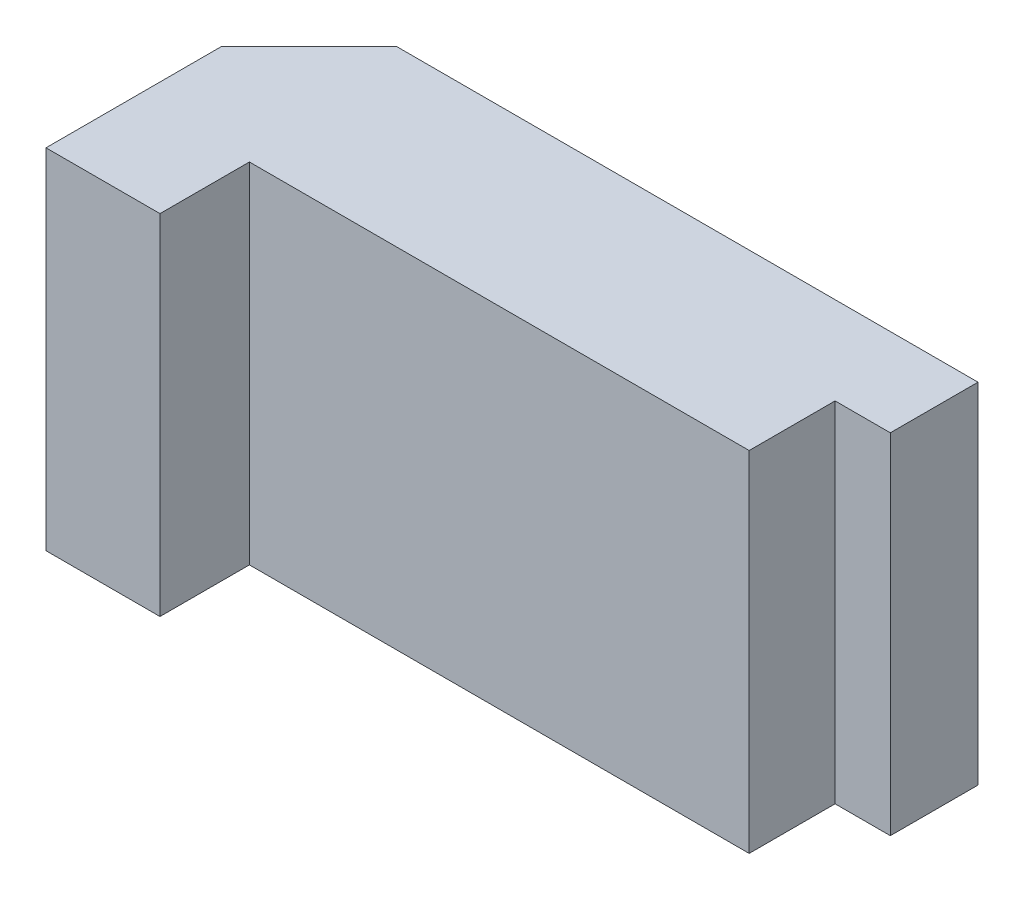
ISO-10303-21;
HEADER;
FILE_DESCRIPTION(('STEP AP214'),'2;1');
FILE_NAME('part.step','',(''),(''),'','','');
FILE_SCHEMA(('AUTOMOTIVE_DESIGN { 1 0 10303 214 1 1 1 1 }'));
ENDSEC;
DATA;
#1=APPLICATION_CONTEXT('core data for automotive mechanical design processes');
#2=APPLICATION_PROTOCOL_DEFINITION('international standard','automotive_design',2000,#1);
#3=PRODUCT_CONTEXT('',#1,'mechanical');
#4=PRODUCT('Part','Part','',(#3));
#5=PRODUCT_RELATED_PRODUCT_CATEGORY('part','',(#4));
#6=PRODUCT_DEFINITION_FORMATION('','',#4);
#7=PRODUCT_DEFINITION_CONTEXT('part definition',#1,'design');
#8=PRODUCT_DEFINITION('design','',#6,#7);
#9=PRODUCT_DEFINITION_SHAPE('','',#8);
#10=(LENGTH_UNIT() NAMED_UNIT(*) SI_UNIT(.MILLI.,.METRE.));
#11=(NAMED_UNIT(*) PLANE_ANGLE_UNIT() SI_UNIT($,.RADIAN.));
#12=(NAMED_UNIT(*) SI_UNIT($,.STERADIAN.) SOLID_ANGLE_UNIT());
#13=UNCERTAINTY_MEASURE_WITH_UNIT(LENGTH_MEASURE(1.E-05),#10,'distance_accuracy_value','');
#14=(GEOMETRIC_REPRESENTATION_CONTEXT(3) GLOBAL_UNCERTAINTY_ASSIGNED_CONTEXT((#13)) GLOBAL_UNIT_ASSIGNED_CONTEXT((#10,
#11,#12)) REPRESENTATION_CONTEXT('',''));
#15=CARTESIAN_POINT('',(0.,0.,0.));
#16=DIRECTION('',(0.,0.,1.));
#17=DIRECTION('',(1.,0.,0.));
#18=AXIS2_PLACEMENT_3D('',#15,#16,#17);
#19=CARTESIAN_POINT('',(13.,19.9,0.));
#20=DIRECTION('',(0.,0.,-1.));
#21=DIRECTION('',(-1.,0.,0.));
#22=AXIS2_PLACEMENT_3D('',#19,#20,#21);
#23=PLANE('',#22);
#24=DIRECTION('',(1.,0.,0.));
#25=VECTOR('',#24,1.);
#26=CARTESIAN_POINT('',(13.,-19.9,0.));
#27=LINE('',#26,#25);
#28=CARTESIAN_POINT('',(0.,-19.9,0.));
#29=VERTEX_POINT('',#28);
#30=CARTESIAN_POINT('',(13.,-19.9,0.));
#31=VERTEX_POINT('',#30);
#32=EDGE_CURVE('E166',#29,#31,#27,.T.);
#33=ORIENTED_EDGE('',*,*,#32,.T.);
#34=DIRECTION('',(0.,-1.,0.));
#35=VECTOR('',#34,1.);
#36=CARTESIAN_POINT('',(13.,19.9,0.));
#37=LINE('',#36,#35);
#38=CARTESIAN_POINT('',(13.,19.9,0.));
#39=VERTEX_POINT('',#38);
#40=EDGE_CURVE('E11',#39,#31,#37,.T.);
#41=ORIENTED_EDGE('',*,*,#40,.F.);
#42=DIRECTION('',(1.,0.,0.));
#43=VECTOR('',#42,1.);
#44=CARTESIAN_POINT('',(13.,19.9,0.));
#45=LINE('',#44,#43);
#46=CARTESIAN_POINT('',(0.,19.9,0.));
#47=VERTEX_POINT('',#46);
#48=EDGE_CURVE('E191',#47,#39,#45,.T.);
#49=ORIENTED_EDGE('',*,*,#48,.F.);
#50=DIRECTION('',(0.,-1.,0.));
#51=VECTOR('',#50,1.);
#52=CARTESIAN_POINT('',(0.,19.9,0.));
#53=LINE('',#52,#51);
#54=EDGE_CURVE('E162',#47,#29,#53,.T.);
#55=ORIENTED_EDGE('',*,*,#54,.T.);
#56=EDGE_LOOP('',(#33,#41,#49,#55));
#57=FACE_BOUND('',#56,.T.);
#58=ADVANCED_FACE('F42',(#57),#23,.F.);
#59=CARTESIAN_POINT('',(13.,19.9,-10.2));
#60=DIRECTION('',(-1.,0.,0.));
#61=DIRECTION('',(0.,0.,1.));
#62=AXIS2_PLACEMENT_3D('',#59,#60,#61);
#63=PLANE('',#62);
#64=DIRECTION('',(0.,0.,-1.));
#65=VECTOR('',#64,1.);
#66=CARTESIAN_POINT('',(13.,-19.9,-10.2));
#67=LINE('',#66,#65);
#68=CARTESIAN_POINT('',(13.,-19.9,-10.2));
#69=VERTEX_POINT('',#68);
#70=EDGE_CURVE('E170',#31,#69,#67,.T.);
#71=ORIENTED_EDGE('',*,*,#70,.T.);
#72=DIRECTION('',(0.,-1.,0.));
#73=VECTOR('',#72,1.);
#74=CARTESIAN_POINT('',(13.,19.9,-10.2));
#75=LINE('',#74,#73);
#76=CARTESIAN_POINT('',(13.,19.9,-10.2));
#77=VERTEX_POINT('',#76);
#78=EDGE_CURVE('E51',#77,#69,#75,.T.);
#79=ORIENTED_EDGE('',*,*,#78,.F.);
#80=DIRECTION('',(0.,0.,-1.));
#81=VECTOR('',#80,1.);
#82=CARTESIAN_POINT('',(13.,19.9,-10.2));
#83=LINE('',#82,#81);
#84=EDGE_CURVE('E116',#39,#77,#83,.T.);
#85=ORIENTED_EDGE('',*,*,#84,.F.);
#86=ORIENTED_EDGE('',*,*,#40,.T.);
#87=EDGE_LOOP('',(#71,#79,#85,#86));
#88=FACE_BOUND('',#87,.T.);
#89=ADVANCED_FACE('F244',(#88),#63,.F.);
#90=CARTESIAN_POINT('',(70.,19.9,-10.2));
#91=DIRECTION('',(0.,0.,-1.));
#92=DIRECTION('',(-1.,0.,0.));
#93=AXIS2_PLACEMENT_3D('',#90,#91,#92);
#94=PLANE('',#93);
#95=DIRECTION('',(1.,0.,0.));
#96=VECTOR('',#95,1.);
#97=CARTESIAN_POINT('',(70.,-19.9,-10.2));
#98=LINE('',#97,#96);
#99=CARTESIAN_POINT('',(70.,-19.9,-10.2));
#100=VERTEX_POINT('',#99);
#101=EDGE_CURVE('E173',#69,#100,#98,.T.);
#102=ORIENTED_EDGE('',*,*,#101,.T.);
#103=DIRECTION('',(0.,-1.,0.));
#104=VECTOR('',#103,1.);
#105=CARTESIAN_POINT('',(70.,19.9,-10.2));
#106=LINE('',#105,#104);
#107=CARTESIAN_POINT('',(70.,19.9,-10.2));
#108=VERTEX_POINT('',#107);
#109=EDGE_CURVE('E205',#108,#100,#106,.T.);
#110=ORIENTED_EDGE('',*,*,#109,.F.);
#111=DIRECTION('',(1.,0.,0.));
#112=VECTOR('',#111,1.);
#113=CARTESIAN_POINT('',(70.,19.9,-10.2));
#114=LINE('',#113,#112);
#115=EDGE_CURVE('E215',#77,#108,#114,.T.);
#116=ORIENTED_EDGE('',*,*,#115,.F.);
#117=ORIENTED_EDGE('',*,*,#78,.T.);
#118=EDGE_LOOP('',(#102,#110,#116,#117));
#119=FACE_BOUND('',#118,.T.);
#120=ADVANCED_FACE('F213',(#119),#94,.F.);
#121=CARTESIAN_POINT('',(70.,19.9,-20.));
#122=DIRECTION('',(-1.,0.,0.));
#123=DIRECTION('',(0.,0.,1.));
#124=AXIS2_PLACEMENT_3D('',#121,#122,#123);
#125=PLANE('',#124);
#126=DIRECTION('',(0.,0.,-1.));
#127=VECTOR('',#126,1.);
#128=CARTESIAN_POINT('',(70.,-19.9,-20.));
#129=LINE('',#128,#127);
#130=CARTESIAN_POINT('',(70.,-19.9,-20.));
#131=VERTEX_POINT('',#130);
#132=EDGE_CURVE('E176',#100,#131,#129,.T.);
#133=ORIENTED_EDGE('',*,*,#132,.T.);
#134=DIRECTION('',(0.,-1.,0.));
#135=VECTOR('',#134,1.);
#136=CARTESIAN_POINT('',(70.,19.9,-20.));
#137=LINE('',#136,#135);
#138=CARTESIAN_POINT('',(70.,19.9,-20.));
#139=VERTEX_POINT('',#138);
#140=EDGE_CURVE('E201',#139,#131,#137,.T.);
#141=ORIENTED_EDGE('',*,*,#140,.F.);
#142=DIRECTION('',(0.,0.,-1.));
#143=VECTOR('',#142,1.);
#144=CARTESIAN_POINT('',(70.,19.9,-20.));
#145=LINE('',#144,#143);
#146=EDGE_CURVE('E232',#108,#139,#145,.T.);
#147=ORIENTED_EDGE('',*,*,#146,.F.);
#148=ORIENTED_EDGE('',*,*,#109,.T.);
#149=EDGE_LOOP('',(#133,#141,#147,#148));
#150=FACE_BOUND('',#149,.T.);
#151=ADVANCED_FACE('F224',(#150),#125,.F.);
#152=CARTESIAN_POINT('',(76.3,19.9,-20.));
#153=DIRECTION('',(0.,0.,-1.));
#154=DIRECTION('',(-1.,0.,0.));
#155=AXIS2_PLACEMENT_3D('',#152,#153,#154);
#156=PLANE('',#155);
#157=DIRECTION('',(1.,0.,0.));
#158=VECTOR('',#157,1.);
#159=CARTESIAN_POINT('',(76.3,-19.9,-20.));
#160=LINE('',#159,#158);
#161=CARTESIAN_POINT('',(76.3,-19.9,-20.));
#162=VERTEX_POINT('',#161);
#163=EDGE_CURVE('E179',#131,#162,#160,.T.);
#164=ORIENTED_EDGE('',*,*,#163,.T.);
#165=DIRECTION('',(0.,-1.,0.));
#166=VECTOR('',#165,1.);
#167=CARTESIAN_POINT('',(76.3,19.9,-20.));
#168=LINE('',#167,#166);
#169=CARTESIAN_POINT('',(76.3,19.9,-20.));
#170=VERTEX_POINT('',#169);
#171=EDGE_CURVE('E197',#170,#162,#168,.T.);
#172=ORIENTED_EDGE('',*,*,#171,.F.);
#173=DIRECTION('',(1.,0.,0.));
#174=VECTOR('',#173,1.);
#175=CARTESIAN_POINT('',(76.3,19.9,-20.));
#176=LINE('',#175,#174);
#177=EDGE_CURVE('E230',#139,#170,#176,.T.);
#178=ORIENTED_EDGE('',*,*,#177,.F.);
#179=ORIENTED_EDGE('',*,*,#140,.T.);
#180=EDGE_LOOP('',(#164,#172,#178,#179));
#181=FACE_BOUND('',#180,.T.);
#182=ADVANCED_FACE('F228',(#181),#156,.F.);
#183=CARTESIAN_POINT('',(76.3,19.9,-30.));
#184=DIRECTION('',(-1.,0.,0.));
#185=DIRECTION('',(0.,0.,1.));
#186=AXIS2_PLACEMENT_3D('',#183,#184,#185);
#187=PLANE('',#186);
#188=DIRECTION('',(0.,0.,-1.));
#189=VECTOR('',#188,1.);
#190=CARTESIAN_POINT('',(76.3,-19.9,-30.));
#191=LINE('',#190,#189);
#192=CARTESIAN_POINT('',(76.3,-19.9,-30.));
#193=VERTEX_POINT('',#192);
#194=EDGE_CURVE('E182',#162,#193,#191,.T.);
#195=ORIENTED_EDGE('',*,*,#194,.T.);
#196=DIRECTION('',(0.,-1.,0.));
#197=VECTOR('',#196,1.);
#198=CARTESIAN_POINT('',(76.3,19.9,-30.));
#199=LINE('',#198,#197);
#200=CARTESIAN_POINT('',(76.3,19.9,-30.));
#201=VERTEX_POINT('',#200);
#202=EDGE_CURVE('E154',#201,#193,#199,.T.);
#203=ORIENTED_EDGE('',*,*,#202,.F.);
#204=DIRECTION('',(0.,0.,-1.));
#205=VECTOR('',#204,1.);
#206=CARTESIAN_POINT('',(76.3,19.9,-30.));
#207=LINE('',#206,#205);
#208=EDGE_CURVE('E143',#170,#201,#207,.T.);
#209=ORIENTED_EDGE('',*,*,#208,.F.);
#210=ORIENTED_EDGE('',*,*,#171,.T.);
#211=EDGE_LOOP('',(#195,#203,#209,#210));
#212=FACE_BOUND('',#211,.T.);
#213=ADVANCED_FACE('F256',(#212),#187,.F.);
#214=CARTESIAN_POINT('',(10.,19.9,-30.));
#215=DIRECTION('',(0.,0.,1.));
#216=DIRECTION('',(1.,0.,0.));
#217=AXIS2_PLACEMENT_3D('',#214,#215,#216);
#218=PLANE('',#217);
#219=DIRECTION('',(-1.,0.,0.));
#220=VECTOR('',#219,1.);
#221=CARTESIAN_POINT('',(10.,-19.9,-30.));
#222=LINE('',#221,#220);
#223=CARTESIAN_POINT('',(10.,-19.9,-30.));
#224=VERTEX_POINT('',#223);
#225=EDGE_CURVE('E152',#193,#224,#222,.T.);
#226=ORIENTED_EDGE('',*,*,#225,.T.);
#227=DIRECTION('',(0.,-1.,0.));
#228=VECTOR('',#227,1.);
#229=CARTESIAN_POINT('',(10.,19.9,-30.));
#230=LINE('',#229,#228);
#231=CARTESIAN_POINT('',(10.,19.9,-30.));
#232=VERTEX_POINT('',#231);
#233=EDGE_CURVE('E149',#232,#224,#230,.T.);
#234=ORIENTED_EDGE('',*,*,#233,.F.);
#235=DIRECTION('',(-1.,0.,0.));
#236=VECTOR('',#235,1.);
#237=CARTESIAN_POINT('',(10.,19.9,-30.));
#238=LINE('',#237,#236);
#239=EDGE_CURVE('E137',#201,#232,#238,.T.);
#240=ORIENTED_EDGE('',*,*,#239,.F.);
#241=ORIENTED_EDGE('',*,*,#202,.T.);
#242=EDGE_LOOP('',(#226,#234,#240,#241));
#243=FACE_BOUND('',#242,.T.);
#244=ADVANCED_FACE('F150',(#243),#218,.F.);
#245=CARTESIAN_POINT('',(0.,19.9,-20.));
#246=DIRECTION('',(0.707106781186546,0.,0.707106781186549));
#247=DIRECTION('',(0.707106781186549,0.,-0.707106781186546));
#248=AXIS2_PLACEMENT_3D('',#245,#246,#247);
#249=PLANE('',#248);
#250=DIRECTION('',(-0.707106781186549,0.,0.707106781186546));
#251=VECTOR('',#250,1.);
#252=CARTESIAN_POINT('',(0.,-19.9,-20.));
#253=LINE('',#252,#251);
#254=CARTESIAN_POINT('',(0.,-19.9,-20.));
#255=VERTEX_POINT('',#254);
#256=EDGE_CURVE('E100',#224,#255,#253,.T.);
#257=ORIENTED_EDGE('',*,*,#256,.T.);
#258=DIRECTION('',(0.,-1.,0.));
#259=VECTOR('',#258,1.);
#260=CARTESIAN_POINT('',(0.,19.9,-20.));
#261=LINE('',#260,#259);
#262=CARTESIAN_POINT('',(0.,19.9,-20.));
#263=VERTEX_POINT('',#262);
#264=EDGE_CURVE('E155',#263,#255,#261,.T.);
#265=ORIENTED_EDGE('',*,*,#264,.F.);
#266=DIRECTION('',(-0.707106781186549,0.,0.707106781186546));
#267=VECTOR('',#266,1.);
#268=CARTESIAN_POINT('',(0.,19.9,-20.));
#269=LINE('',#268,#267);
#270=EDGE_CURVE('E141',#232,#263,#269,.T.);
#271=ORIENTED_EDGE('',*,*,#270,.F.);
#272=ORIENTED_EDGE('',*,*,#233,.T.);
#273=EDGE_LOOP('',(#257,#265,#271,#272));
#274=FACE_BOUND('',#273,.T.);
#275=ADVANCED_FACE('F157',(#274),#249,.F.);
#276=CARTESIAN_POINT('',(0.,19.9,0.));
#277=DIRECTION('',(1.,0.,0.));
#278=DIRECTION('',(0.,0.,-1.));
#279=AXIS2_PLACEMENT_3D('',#276,#277,#278);
#280=PLANE('',#279);
#281=DIRECTION('',(0.,0.,1.));
#282=VECTOR('',#281,1.);
#283=CARTESIAN_POINT('',(0.,-19.9,0.));
#284=LINE('',#283,#282);
#285=EDGE_CURVE('E106',#255,#29,#284,.T.);
#286=ORIENTED_EDGE('',*,*,#285,.T.);
#287=ORIENTED_EDGE('',*,*,#54,.F.);
#288=DIRECTION('',(0.,0.,1.));
#289=VECTOR('',#288,1.);
#290=CARTESIAN_POINT('',(0.,19.9,0.));
#291=LINE('',#290,#289);
#292=EDGE_CURVE('E59',#263,#47,#291,.T.);
#293=ORIENTED_EDGE('',*,*,#292,.F.);
#294=ORIENTED_EDGE('',*,*,#264,.T.);
#295=EDGE_LOOP('',(#286,#287,#293,#294));
#296=FACE_BOUND('',#295,.T.);
#297=ADVANCED_FACE('F264',(#296),#280,.F.);
#298=CARTESIAN_POINT('',(0.,19.9,0.));
#299=DIRECTION('',(0.,-1.,0.));
#300=DIRECTION('',(0.,0.,-1.));
#301=AXIS2_PLACEMENT_3D('',#298,#299,#300);
#302=PLANE('',#301);
#303=ORIENTED_EDGE('',*,*,#48,.T.);
#304=ORIENTED_EDGE('',*,*,#84,.T.);
#305=ORIENTED_EDGE('',*,*,#115,.T.);
#306=ORIENTED_EDGE('',*,*,#146,.T.);
#307=ORIENTED_EDGE('',*,*,#177,.T.);
#308=ORIENTED_EDGE('',*,*,#208,.T.);
#309=ORIENTED_EDGE('',*,*,#239,.T.);
#310=ORIENTED_EDGE('',*,*,#270,.T.);
#311=ORIENTED_EDGE('',*,*,#292,.T.);
#312=EDGE_LOOP('',(#303,#304,#305,#306,#307,#308,#309,#310,#311));
#313=FACE_BOUND('',#312,.T.);
#314=ADVANCED_FACE('F139',(#313),#302,.F.);
#315=CARTESIAN_POINT('',(0.,-19.9,0.));
#316=DIRECTION('',(0.,-1.,0.));
#317=DIRECTION('',(0.,0.,-1.));
#318=AXIS2_PLACEMENT_3D('',#315,#316,#317);
#319=PLANE('',#318);
#320=ORIENTED_EDGE('',*,*,#32,.F.);
#321=ORIENTED_EDGE('',*,*,#285,.F.);
#322=ORIENTED_EDGE('',*,*,#256,.F.);
#323=ORIENTED_EDGE('',*,*,#225,.F.);
#324=ORIENTED_EDGE('',*,*,#194,.F.);
#325=ORIENTED_EDGE('',*,*,#163,.F.);
#326=ORIENTED_EDGE('',*,*,#132,.F.);
#327=ORIENTED_EDGE('',*,*,#101,.F.);
#328=ORIENTED_EDGE('',*,*,#70,.F.);
#329=EDGE_LOOP('',(#320,#321,#322,#323,#324,#325,#326,#327,#328));
#330=FACE_BOUND('',#329,.T.);
#331=ADVANCED_FACE('F219',(#330),#319,.T.);
#332=CLOSED_SHELL('',(#58,#89,#120,#151,#182,#213,#244,#275,#297,#314,#331));
#333=MANIFOLD_SOLID_BREP('B2',#332);
#334=ADVANCED_BREP_SHAPE_REPRESENTATION('',(#18,#333),#14);
#335=SHAPE_DEFINITION_REPRESENTATION(#9,#334);
ENDSEC;
END-ISO-10303-21;
